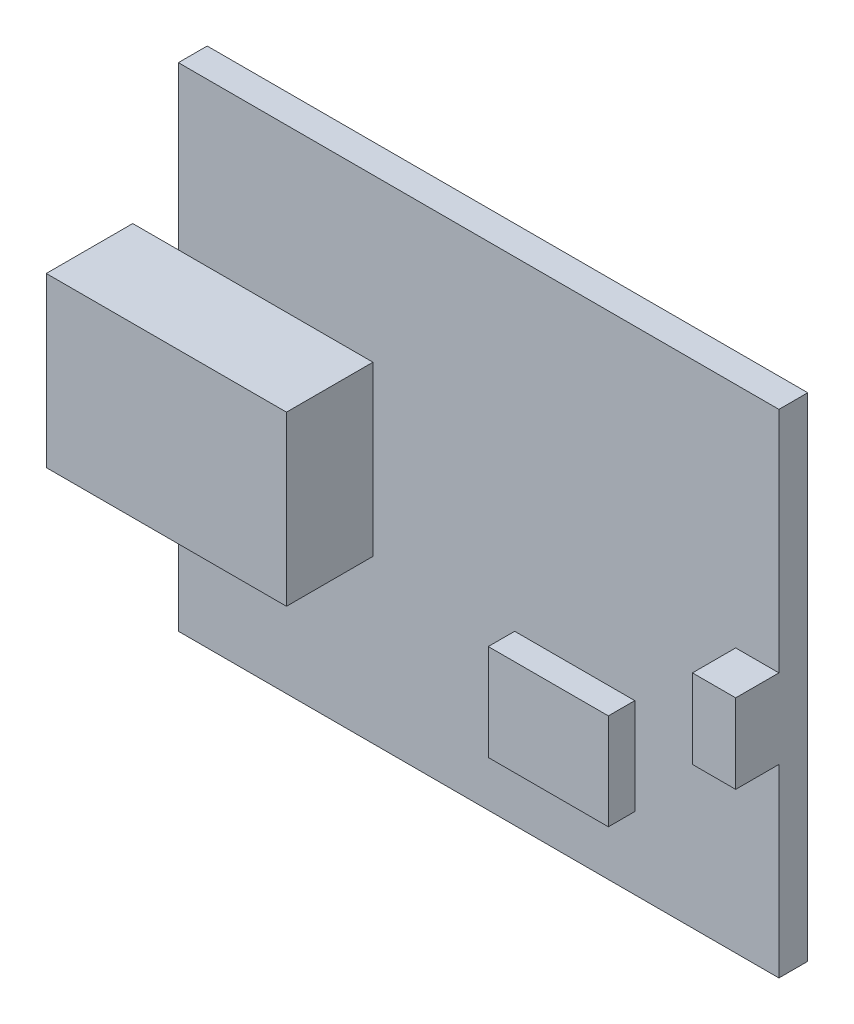
ISO-10303-21;
HEADER;
FILE_DESCRIPTION(('STEP AP214'),'2;1');
FILE_NAME('part.step','',(''),(''),'','','');
FILE_SCHEMA(('AUTOMOTIVE_DESIGN { 1 0 10303 214 1 1 1 1 }'));
ENDSEC;
DATA;
#1=APPLICATION_CONTEXT('core data for automotive mechanical design processes');
#2=APPLICATION_PROTOCOL_DEFINITION('international standard','automotive_design',2000,#1);
#3=PRODUCT_CONTEXT('',#1,'mechanical');
#4=PRODUCT('Part','Part','',(#3));
#5=PRODUCT_RELATED_PRODUCT_CATEGORY('part','',(#4));
#6=PRODUCT_DEFINITION_FORMATION('','',#4);
#7=PRODUCT_DEFINITION_CONTEXT('part definition',#1,'design');
#8=PRODUCT_DEFINITION('design','',#6,#7);
#9=PRODUCT_DEFINITION_SHAPE('','',#8);
#10=(LENGTH_UNIT() NAMED_UNIT(*) SI_UNIT(.MILLI.,.METRE.));
#11=(NAMED_UNIT(*) PLANE_ANGLE_UNIT() SI_UNIT($,.RADIAN.));
#12=(NAMED_UNIT(*) SI_UNIT($,.STERADIAN.) SOLID_ANGLE_UNIT());
#13=UNCERTAINTY_MEASURE_WITH_UNIT(LENGTH_MEASURE(1.E-05),#10,'distance_accuracy_value','');
#14=(GEOMETRIC_REPRESENTATION_CONTEXT(3) GLOBAL_UNCERTAINTY_ASSIGNED_CONTEXT((#13)) GLOBAL_UNIT_ASSIGNED_CONTEXT((#10,
#11,#12)) REPRESENTATION_CONTEXT('',''));
#15=CARTESIAN_POINT('',(0.,0.,0.));
#16=DIRECTION('',(0.,0.,1.));
#17=DIRECTION('',(1.,0.,0.));
#18=AXIS2_PLACEMENT_3D('',#15,#16,#17);
#19=CARTESIAN_POINT('',(-12.5,10.25,1.2));
#20=DIRECTION('',(0.,0.,-1.));
#21=DIRECTION('',(-1.,0.,0.));
#22=AXIS2_PLACEMENT_3D('',#19,#20,#21);
#23=PLANE('',#22);
#24=DIRECTION('',(1.,0.,0.));
#25=VECTOR('',#24,1.);
#26=CARTESIAN_POINT('',(10.7,-2.55,1.2));
#27=LINE('',#26,#25);
#28=CARTESIAN_POINT('',(10.7,-2.55,1.2));
#29=VERTEX_POINT('',#28);
#30=CARTESIAN_POINT('',(12.5,-2.55000000000001,1.2));
#31=VERTEX_POINT('',#30);
#32=EDGE_CURVE('E174',#29,#31,#27,.T.);
#33=ORIENTED_EDGE('',*,*,#32,.F.);
#34=DIRECTION('',(0.,-1.,0.));
#35=VECTOR('',#34,1.);
#36=CARTESIAN_POINT('',(10.7,0.749999999999997,1.2));
#37=LINE('',#36,#35);
#38=CARTESIAN_POINT('',(10.7,0.749999999999997,1.2));
#39=VERTEX_POINT('',#38);
#40=EDGE_CURVE('E171',#39,#29,#37,.T.);
#41=ORIENTED_EDGE('',*,*,#40,.F.);
#42=DIRECTION('',(-1.,0.,0.));
#43=VECTOR('',#42,1.);
#44=CARTESIAN_POINT('',(10.7,0.749999999999997,1.2));
#45=LINE('',#44,#43);
#46=CARTESIAN_POINT('',(12.5,0.749999999999997,1.2));
#47=VERTEX_POINT('',#46);
#48=EDGE_CURVE('E184',#47,#39,#45,.T.);
#49=ORIENTED_EDGE('',*,*,#48,.F.);
#50=DIRECTION('',(0.,1.,0.));
#51=VECTOR('',#50,1.);
#52=CARTESIAN_POINT('',(12.5,-10.25,1.2));
#53=LINE('',#52,#51);
#54=CARTESIAN_POINT('',(12.5,10.25,1.2));
#55=VERTEX_POINT('',#54);
#56=EDGE_CURVE('E250',#47,#55,#53,.T.);
#57=ORIENTED_EDGE('',*,*,#56,.T.);
#58=DIRECTION('',(-1.,0.,0.));
#59=VECTOR('',#58,1.);
#60=CARTESIAN_POINT('',(-12.5,10.25,1.2));
#61=LINE('',#60,#59);
#62=CARTESIAN_POINT('',(-12.5,10.25,1.2));
#63=VERTEX_POINT('',#62);
#64=EDGE_CURVE('E253',#55,#63,#61,.T.);
#65=ORIENTED_EDGE('',*,*,#64,.T.);
#66=DIRECTION('',(0.,-1.,0.));
#67=VECTOR('',#66,1.);
#68=CARTESIAN_POINT('',(-12.5,-10.25,1.2));
#69=LINE('',#68,#67);
#70=CARTESIAN_POINT('',(-12.5,3.5,1.2));
#71=VERTEX_POINT('',#70);
#72=EDGE_CURVE('E243',#63,#71,#69,.T.);
#73=ORIENTED_EDGE('',*,*,#72,.T.);
#74=DIRECTION('',(-1.,0.,0.));
#75=VECTOR('',#74,1.);
#76=CARTESIAN_POINT('',(-4.4,3.5,1.2));
#77=LINE('',#76,#75);
#78=CARTESIAN_POINT('',(-4.4,3.5,1.2));
#79=VERTEX_POINT('',#78);
#80=EDGE_CURVE('E231',#79,#71,#77,.T.);
#81=ORIENTED_EDGE('',*,*,#80,.F.);
#82=DIRECTION('',(0.,-1.,0.));
#83=VECTOR('',#82,1.);
#84=CARTESIAN_POINT('',(-4.4,3.5,1.2));
#85=LINE('',#84,#83);
#86=CARTESIAN_POINT('',(-4.4,-3.5,1.2));
#87=VERTEX_POINT('',#86);
#88=EDGE_CURVE('E207',#79,#87,#85,.T.);
#89=ORIENTED_EDGE('',*,*,#88,.T.);
#90=DIRECTION('',(-1.,0.,0.));
#91=VECTOR('',#90,1.);
#92=CARTESIAN_POINT('',(-4.4,-3.5,1.2));
#93=LINE('',#92,#91);
#94=CARTESIAN_POINT('',(-12.5,-3.5,1.2));
#95=VERTEX_POINT('',#94);
#96=EDGE_CURVE('E240',#87,#95,#93,.T.);
#97=ORIENTED_EDGE('',*,*,#96,.T.);
#98=CARTESIAN_POINT('',(-12.5,-10.25,1.2));
#99=VERTEX_POINT('',#98);
#100=EDGE_CURVE('E248',#95,#99,#69,.T.);
#101=ORIENTED_EDGE('',*,*,#100,.T.);
#102=DIRECTION('',(1.,0.,0.));
#103=VECTOR('',#102,1.);
#104=CARTESIAN_POINT('',(-12.5,-10.25,1.2));
#105=LINE('',#104,#103);
#106=CARTESIAN_POINT('',(12.5,-10.25,1.2));
#107=VERTEX_POINT('',#106);
#108=EDGE_CURVE('E246',#99,#107,#105,.T.);
#109=ORIENTED_EDGE('',*,*,#108,.T.);
#110=EDGE_CURVE('E251',#107,#31,#53,.T.);
#111=ORIENTED_EDGE('',*,*,#110,.T.);
#112=EDGE_LOOP('',(#33,#41,#49,#57,#65,#73,#81,#89,#97,#101,#109,#111));
#113=FACE_BOUND('',#112,.T.);
#114=DIRECTION('',(0.,-1.,0.));
#115=VECTOR('',#114,1.);
#116=CARTESIAN_POINT('',(1.5,-3.25,1.2));
#117=LINE('',#116,#115);
#118=CARTESIAN_POINT('',(1.5,-3.25,1.2));
#119=VERTEX_POINT('',#118);
#120=CARTESIAN_POINT('',(1.5,-7.25,1.2));
#121=VERTEX_POINT('',#120);
#122=EDGE_CURVE('E170',#119,#121,#117,.T.);
#123=ORIENTED_EDGE('',*,*,#122,.F.);
#124=DIRECTION('',(-1.,0.,0.));
#125=VECTOR('',#124,1.);
#126=CARTESIAN_POINT('',(1.5,-3.25,1.2));
#127=LINE('',#126,#125);
#128=CARTESIAN_POINT('',(6.5,-3.25,1.2));
#129=VERTEX_POINT('',#128);
#130=EDGE_CURVE('E167',#129,#119,#127,.T.);
#131=ORIENTED_EDGE('',*,*,#130,.F.);
#132=DIRECTION('',(0.,1.,0.));
#133=VECTOR('',#132,1.);
#134=CARTESIAN_POINT('',(6.5,-3.25,1.2));
#135=LINE('',#134,#133);
#136=CARTESIAN_POINT('',(6.5,-7.25,1.2));
#137=VERTEX_POINT('',#136);
#138=EDGE_CURVE('E51',#137,#129,#135,.T.);
#139=ORIENTED_EDGE('',*,*,#138,.F.);
#140=DIRECTION('',(1.,0.,0.));
#141=VECTOR('',#140,1.);
#142=CARTESIAN_POINT('',(1.5,-7.25,1.2));
#143=LINE('',#142,#141);
#144=EDGE_CURVE('E46',#121,#137,#143,.T.);
#145=ORIENTED_EDGE('',*,*,#144,.F.);
#146=EDGE_LOOP('',(#123,#131,#139,#145));
#147=FACE_BOUND('',#146,.T.);
#148=ADVANCED_FACE('F31',(#113,#147),#23,.F.);
#149=CARTESIAN_POINT('',(-12.5,-10.25,1.2));
#150=DIRECTION('',(1.,0.,0.));
#151=DIRECTION('',(0.,0.,-1.));
#152=AXIS2_PLACEMENT_3D('',#149,#150,#151);
#153=PLANE('',#152);
#154=DIRECTION('',(0.,-1.,0.));
#155=VECTOR('',#154,1.);
#156=CARTESIAN_POINT('',(-12.5,-10.25,0.));
#157=LINE('',#156,#155);
#158=CARTESIAN_POINT('',(-12.5,10.25,0.));
#159=VERTEX_POINT('',#158);
#160=CARTESIAN_POINT('',(-12.5,-10.25,0.));
#161=VERTEX_POINT('',#160);
#162=EDGE_CURVE('E234',#159,#161,#157,.T.);
#163=ORIENTED_EDGE('',*,*,#162,.T.);
#164=DIRECTION('',(0.,0.,-1.));
#165=VECTOR('',#164,1.);
#166=CARTESIAN_POINT('',(-12.5,-10.25,1.2));
#167=LINE('',#166,#165);
#168=EDGE_CURVE('E11',#99,#161,#167,.T.);
#169=ORIENTED_EDGE('',*,*,#168,.F.);
#170=ORIENTED_EDGE('',*,*,#100,.F.);
#171=EDGE_CURVE('E247',#71,#95,#69,.T.);
#172=ORIENTED_EDGE('',*,*,#171,.F.);
#173=ORIENTED_EDGE('',*,*,#72,.F.);
#174=DIRECTION('',(0.,0.,-1.));
#175=VECTOR('',#174,1.);
#176=CARTESIAN_POINT('',(-12.5,10.25,1.2));
#177=LINE('',#176,#175);
#178=EDGE_CURVE('E255',#63,#159,#177,.T.);
#179=ORIENTED_EDGE('',*,*,#178,.T.);
#180=EDGE_LOOP('',(#163,#169,#170,#172,#173,#179));
#181=FACE_BOUND('',#180,.T.);
#182=ADVANCED_FACE('F33',(#181),#153,.F.);
#183=CARTESIAN_POINT('',(-12.5,-10.25,1.2));
#184=DIRECTION('',(0.,1.,0.));
#185=DIRECTION('',(0.,0.,1.));
#186=AXIS2_PLACEMENT_3D('',#183,#184,#185);
#187=PLANE('',#186);
#188=DIRECTION('',(1.,0.,0.));
#189=VECTOR('',#188,1.);
#190=CARTESIAN_POINT('',(-12.5,-10.25,0.));
#191=LINE('',#190,#189);
#192=CARTESIAN_POINT('',(12.5,-10.25,0.));
#193=VERTEX_POINT('',#192);
#194=EDGE_CURVE('E258',#161,#193,#191,.T.);
#195=ORIENTED_EDGE('',*,*,#194,.T.);
#196=DIRECTION('',(0.,0.,-1.));
#197=VECTOR('',#196,1.);
#198=CARTESIAN_POINT('',(12.5,-10.25,1.2));
#199=LINE('',#198,#197);
#200=EDGE_CURVE('E39',#107,#193,#199,.T.);
#201=ORIENTED_EDGE('',*,*,#200,.F.);
#202=ORIENTED_EDGE('',*,*,#108,.F.);
#203=ORIENTED_EDGE('',*,*,#168,.T.);
#204=EDGE_LOOP('',(#195,#201,#202,#203));
#205=FACE_BOUND('',#204,.T.);
#206=ADVANCED_FACE('F307',(#205),#187,.F.);
#207=CARTESIAN_POINT('',(12.5,-10.25,1.2));
#208=DIRECTION('',(-1.,0.,0.));
#209=DIRECTION('',(0.,0.,1.));
#210=AXIS2_PLACEMENT_3D('',#207,#208,#209);
#211=PLANE('',#210);
#212=DIRECTION('',(0.,1.,0.));
#213=VECTOR('',#212,1.);
#214=CARTESIAN_POINT('',(12.5,-10.25,0.));
#215=LINE('',#214,#213);
#216=CARTESIAN_POINT('',(12.5,10.25,0.));
#217=VERTEX_POINT('',#216);
#218=EDGE_CURVE('E260',#193,#217,#215,.T.);
#219=ORIENTED_EDGE('',*,*,#218,.T.);
#220=DIRECTION('',(0.,0.,-1.));
#221=VECTOR('',#220,1.);
#222=CARTESIAN_POINT('',(12.5,10.25,1.2));
#223=LINE('',#222,#221);
#224=EDGE_CURVE('E266',#55,#217,#223,.T.);
#225=ORIENTED_EDGE('',*,*,#224,.F.);
#226=ORIENTED_EDGE('',*,*,#56,.F.);
#227=DIRECTION('',(0.,0.,-1.));
#228=VECTOR('',#227,1.);
#229=CARTESIAN_POINT('',(12.5,0.749999999999997,3.));
#230=LINE('',#229,#228);
#231=CARTESIAN_POINT('',(12.5,0.749999999999997,3.));
#232=VERTEX_POINT('',#231);
#233=EDGE_CURVE('E197',#232,#47,#230,.T.);
#234=ORIENTED_EDGE('',*,*,#233,.F.);
#235=DIRECTION('',(0.,1.,0.));
#236=VECTOR('',#235,1.);
#237=CARTESIAN_POINT('',(12.5,0.749999999999997,3.));
#238=LINE('',#237,#236);
#239=CARTESIAN_POINT('',(12.5,-2.55,3.));
#240=VERTEX_POINT('',#239);
#241=EDGE_CURVE('E186',#240,#232,#238,.T.);
#242=ORIENTED_EDGE('',*,*,#241,.F.);
#243=DIRECTION('',(0.,0.,-1.));
#244=VECTOR('',#243,1.);
#245=CARTESIAN_POINT('',(12.5,-2.55,3.));
#246=LINE('',#245,#244);
#247=EDGE_CURVE('E200',#240,#31,#246,.T.);
#248=ORIENTED_EDGE('',*,*,#247,.T.);
#249=ORIENTED_EDGE('',*,*,#110,.F.);
#250=ORIENTED_EDGE('',*,*,#200,.T.);
#251=EDGE_LOOP('',(#219,#225,#226,#234,#242,#248,#249,#250));
#252=FACE_BOUND('',#251,.T.);
#253=ADVANCED_FACE('F273',(#252),#211,.F.);
#254=CARTESIAN_POINT('',(-12.5,10.25,1.2));
#255=DIRECTION('',(0.,-1.,0.));
#256=DIRECTION('',(1.,0.,0.));
#257=AXIS2_PLACEMENT_3D('',#254,#255,#256);
#258=PLANE('',#257);
#259=DIRECTION('',(-1.,0.,0.));
#260=VECTOR('',#259,1.);
#261=CARTESIAN_POINT('',(-12.5,10.25,0.));
#262=LINE('',#261,#260);
#263=EDGE_CURVE('E262',#217,#159,#262,.T.);
#264=ORIENTED_EDGE('',*,*,#263,.T.);
#265=ORIENTED_EDGE('',*,*,#178,.F.);
#266=ORIENTED_EDGE('',*,*,#64,.F.);
#267=ORIENTED_EDGE('',*,*,#224,.T.);
#268=EDGE_LOOP('',(#264,#265,#266,#267));
#269=FACE_BOUND('',#268,.T.);
#270=ADVANCED_FACE('F283',(#269),#258,.F.);
#271=CARTESIAN_POINT('',(-12.5,10.25,0.));
#272=DIRECTION('',(0.,0.,-1.));
#273=DIRECTION('',(-1.,0.,0.));
#274=AXIS2_PLACEMENT_3D('',#271,#272,#273);
#275=PLANE('',#274);
#276=ORIENTED_EDGE('',*,*,#162,.F.);
#277=ORIENTED_EDGE('',*,*,#263,.F.);
#278=ORIENTED_EDGE('',*,*,#218,.F.);
#279=ORIENTED_EDGE('',*,*,#194,.F.);
#280=EDGE_LOOP('',(#276,#277,#278,#279));
#281=FACE_BOUND('',#280,.T.);
#282=ADVANCED_FACE('F280',(#281),#275,.T.);
#283=CARTESIAN_POINT('',(-4.4,3.5,1.2));
#284=DIRECTION('',(0.,0.,-1.));
#285=DIRECTION('',(0.,1.,0.));
#286=AXIS2_PLACEMENT_3D('',#283,#284,#285);
#287=PLANE('',#286);
#288=CARTESIAN_POINT('',(-14.4,3.5,1.2));
#289=VERTEX_POINT('',#288);
#290=EDGE_CURVE('E235',#71,#289,#77,.T.);
#291=ORIENTED_EDGE('',*,*,#290,.F.);
#292=ORIENTED_EDGE('',*,*,#171,.T.);
#293=CARTESIAN_POINT('',(-14.4,-3.5,1.2));
#294=VERTEX_POINT('',#293);
#295=EDGE_CURVE('E220',#95,#294,#93,.T.);
#296=ORIENTED_EDGE('',*,*,#295,.T.);
#297=DIRECTION('',(0.,-1.,0.));
#298=VECTOR('',#297,1.);
#299=CARTESIAN_POINT('',(-14.4,3.5,1.2));
#300=LINE('',#299,#298);
#301=EDGE_CURVE('E206',#289,#294,#300,.T.);
#302=ORIENTED_EDGE('',*,*,#301,.F.);
#303=EDGE_LOOP('',(#291,#292,#296,#302));
#304=FACE_BOUND('',#303,.T.);
#305=ADVANCED_FACE('F309',(#304),#287,.T.);
#306=CARTESIAN_POINT('',(-4.4,3.5,1.2));
#307=DIRECTION('',(0.,1.,0.));
#308=DIRECTION('',(0.,0.,1.));
#309=AXIS2_PLACEMENT_3D('',#306,#307,#308);
#310=PLANE('',#309);
#311=DIRECTION('',(0.,0.,-1.));
#312=VECTOR('',#311,1.);
#313=CARTESIAN_POINT('',(-14.4,3.5,1.2));
#314=LINE('',#313,#312);
#315=CARTESIAN_POINT('',(-14.4,3.5,4.8));
#316=VERTEX_POINT('',#315);
#317=EDGE_CURVE('E211',#316,#289,#314,.T.);
#318=ORIENTED_EDGE('',*,*,#317,.F.);
#319=DIRECTION('',(-1.,0.,0.));
#320=VECTOR('',#319,1.);
#321=CARTESIAN_POINT('',(-4.4,3.5,4.8));
#322=LINE('',#321,#320);
#323=CARTESIAN_POINT('',(-4.4,3.5,4.8));
#324=VERTEX_POINT('',#323);
#325=EDGE_CURVE('E236',#324,#316,#322,.T.);
#326=ORIENTED_EDGE('',*,*,#325,.F.);
#327=DIRECTION('',(0.,0.,-1.));
#328=VECTOR('',#327,1.);
#329=CARTESIAN_POINT('',(-4.4,3.5,1.2));
#330=LINE('',#329,#328);
#331=EDGE_CURVE('E217',#324,#79,#330,.T.);
#332=ORIENTED_EDGE('',*,*,#331,.T.);
#333=ORIENTED_EDGE('',*,*,#80,.T.);
#334=ORIENTED_EDGE('',*,*,#290,.T.);
#335=EDGE_LOOP('',(#318,#326,#332,#333,#334));
#336=FACE_BOUND('',#335,.T.);
#337=ADVANCED_FACE('F326',(#336),#310,.T.);
#338=CARTESIAN_POINT('',(-4.4,3.5,4.8));
#339=DIRECTION('',(0.,0.,1.));
#340=DIRECTION('',(1.,0.,0.));
#341=AXIS2_PLACEMENT_3D('',#338,#339,#340);
#342=PLANE('',#341);
#343=DIRECTION('',(0.,1.,0.));
#344=VECTOR('',#343,1.);
#345=CARTESIAN_POINT('',(-14.4,3.5,4.8));
#346=LINE('',#345,#344);
#347=CARTESIAN_POINT('',(-14.4,-3.5,4.8));
#348=VERTEX_POINT('',#347);
#349=EDGE_CURVE('E226',#348,#316,#346,.T.);
#350=ORIENTED_EDGE('',*,*,#349,.F.);
#351=DIRECTION('',(-1.,0.,0.));
#352=VECTOR('',#351,1.);
#353=CARTESIAN_POINT('',(-4.4,-3.5,4.8));
#354=LINE('',#353,#352);
#355=CARTESIAN_POINT('',(-4.4,-3.5,4.8));
#356=VERTEX_POINT('',#355);
#357=EDGE_CURVE('E238',#356,#348,#354,.T.);
#358=ORIENTED_EDGE('',*,*,#357,.F.);
#359=DIRECTION('',(0.,1.,0.));
#360=VECTOR('',#359,1.);
#361=CARTESIAN_POINT('',(-4.4,3.5,4.8));
#362=LINE('',#361,#360);
#363=EDGE_CURVE('E214',#356,#324,#362,.T.);
#364=ORIENTED_EDGE('',*,*,#363,.T.);
#365=ORIENTED_EDGE('',*,*,#325,.T.);
#366=EDGE_LOOP('',(#350,#358,#364,#365));
#367=FACE_BOUND('',#366,.T.);
#368=ADVANCED_FACE('F321',(#367),#342,.T.);
#369=CARTESIAN_POINT('',(-4.4,-3.5,1.2));
#370=DIRECTION('',(0.,-1.,0.));
#371=DIRECTION('',(0.,0.,-1.));
#372=AXIS2_PLACEMENT_3D('',#369,#370,#371);
#373=PLANE('',#372);
#374=DIRECTION('',(0.,0.,1.));
#375=VECTOR('',#374,1.);
#376=CARTESIAN_POINT('',(-14.4,-3.5,1.2));
#377=LINE('',#376,#375);
#378=EDGE_CURVE('E223',#294,#348,#377,.T.);
#379=ORIENTED_EDGE('',*,*,#378,.F.);
#380=ORIENTED_EDGE('',*,*,#295,.F.);
#381=ORIENTED_EDGE('',*,*,#96,.F.);
#382=DIRECTION('',(0.,0.,1.));
#383=VECTOR('',#382,1.);
#384=CARTESIAN_POINT('',(-4.4,-3.5,1.2));
#385=LINE('',#384,#383);
#386=EDGE_CURVE('E210',#87,#356,#385,.T.);
#387=ORIENTED_EDGE('',*,*,#386,.T.);
#388=ORIENTED_EDGE('',*,*,#357,.T.);
#389=EDGE_LOOP('',(#379,#380,#381,#387,#388));
#390=FACE_BOUND('',#389,.T.);
#391=ADVANCED_FACE('F314',(#390),#373,.T.);
#392=CARTESIAN_POINT('',(-4.4,-3.5,1.2));
#393=DIRECTION('',(-1.,0.,0.));
#394=DIRECTION('',(0.,0.,1.));
#395=AXIS2_PLACEMENT_3D('',#392,#393,#394);
#396=PLANE('',#395);
#397=ORIENTED_EDGE('',*,*,#88,.F.);
#398=ORIENTED_EDGE('',*,*,#331,.F.);
#399=ORIENTED_EDGE('',*,*,#363,.F.);
#400=ORIENTED_EDGE('',*,*,#386,.F.);
#401=EDGE_LOOP('',(#397,#398,#399,#400));
#402=FACE_BOUND('',#401,.T.);
#403=ADVANCED_FACE('F317',(#402),#396,.F.);
#404=CARTESIAN_POINT('',(-14.4,-3.5,1.2));
#405=DIRECTION('',(-1.,0.,0.));
#406=DIRECTION('',(0.,0.,1.));
#407=AXIS2_PLACEMENT_3D('',#404,#405,#406);
#408=PLANE('',#407);
#409=ORIENTED_EDGE('',*,*,#301,.T.);
#410=ORIENTED_EDGE('',*,*,#378,.T.);
#411=ORIENTED_EDGE('',*,*,#349,.T.);
#412=ORIENTED_EDGE('',*,*,#317,.T.);
#413=EDGE_LOOP('',(#409,#410,#411,#412));
#414=FACE_BOUND('',#413,.T.);
#415=ADVANCED_FACE('F323',(#414),#408,.T.);
#416=CARTESIAN_POINT('',(10.7,0.749999999999997,3.));
#417=DIRECTION('',(1.,0.,0.));
#418=DIRECTION('',(0.,0.,-1.));
#419=AXIS2_PLACEMENT_3D('',#416,#417,#418);
#420=PLANE('',#419);
#421=ORIENTED_EDGE('',*,*,#40,.T.);
#422=DIRECTION('',(0.,0.,-1.));
#423=VECTOR('',#422,1.);
#424=CARTESIAN_POINT('',(10.7,-2.55,3.));
#425=LINE('',#424,#423);
#426=CARTESIAN_POINT('',(10.7,-2.55,3.));
#427=VERTEX_POINT('',#426);
#428=EDGE_CURVE('E203',#427,#29,#425,.T.);
#429=ORIENTED_EDGE('',*,*,#428,.F.);
#430=DIRECTION('',(0.,-1.,0.));
#431=VECTOR('',#430,1.);
#432=CARTESIAN_POINT('',(10.7,0.749999999999997,3.));
#433=LINE('',#432,#431);
#434=CARTESIAN_POINT('',(10.7,0.749999999999997,3.));
#435=VERTEX_POINT('',#434);
#436=EDGE_CURVE('E180',#435,#427,#433,.T.);
#437=ORIENTED_EDGE('',*,*,#436,.F.);
#438=DIRECTION('',(0.,0.,-1.));
#439=VECTOR('',#438,1.);
#440=CARTESIAN_POINT('',(10.7,0.749999999999997,3.));
#441=LINE('',#440,#439);
#442=EDGE_CURVE('E189',#435,#39,#441,.T.);
#443=ORIENTED_EDGE('',*,*,#442,.T.);
#444=EDGE_LOOP('',(#421,#429,#437,#443));
#445=FACE_BOUND('',#444,.T.);
#446=ADVANCED_FACE('F405',(#445),#420,.F.);
#447=CARTESIAN_POINT('',(10.7,-2.55,3.));
#448=DIRECTION('',(0.,1.,0.));
#449=DIRECTION('',(0.,0.,1.));
#450=AXIS2_PLACEMENT_3D('',#447,#448,#449);
#451=PLANE('',#450);
#452=ORIENTED_EDGE('',*,*,#32,.T.);
#453=ORIENTED_EDGE('',*,*,#247,.F.);
#454=DIRECTION('',(1.,0.,0.));
#455=VECTOR('',#454,1.);
#456=CARTESIAN_POINT('',(10.7,-2.55,3.));
#457=LINE('',#456,#455);
#458=EDGE_CURVE('E183',#427,#240,#457,.T.);
#459=ORIENTED_EDGE('',*,*,#458,.F.);
#460=ORIENTED_EDGE('',*,*,#428,.T.);
#461=EDGE_LOOP('',(#452,#453,#459,#460));
#462=FACE_BOUND('',#461,.T.);
#463=ADVANCED_FACE('F306',(#462),#451,.F.);
#464=CARTESIAN_POINT('',(10.7,0.749999999999997,3.));
#465=DIRECTION('',(0.,-1.,0.));
#466=DIRECTION('',(0.,0.,-1.));
#467=AXIS2_PLACEMENT_3D('',#464,#465,#466);
#468=PLANE('',#467);
#469=ORIENTED_EDGE('',*,*,#48,.T.);
#470=ORIENTED_EDGE('',*,*,#442,.F.);
#471=DIRECTION('',(-1.,0.,0.));
#472=VECTOR('',#471,1.);
#473=CARTESIAN_POINT('',(10.7,0.749999999999997,3.));
#474=LINE('',#473,#472);
#475=EDGE_CURVE('E188',#232,#435,#474,.T.);
#476=ORIENTED_EDGE('',*,*,#475,.F.);
#477=ORIENTED_EDGE('',*,*,#233,.T.);
#478=EDGE_LOOP('',(#469,#470,#476,#477));
#479=FACE_BOUND('',#478,.T.);
#480=ADVANCED_FACE('F299',(#479),#468,.F.);
#481=CARTESIAN_POINT('',(10.7,-2.55,3.));
#482=DIRECTION('',(0.,0.,1.));
#483=DIRECTION('',(1.,0.,0.));
#484=AXIS2_PLACEMENT_3D('',#481,#482,#483);
#485=PLANE('',#484);
#486=ORIENTED_EDGE('',*,*,#436,.T.);
#487=ORIENTED_EDGE('',*,*,#458,.T.);
#488=ORIENTED_EDGE('',*,*,#241,.T.);
#489=ORIENTED_EDGE('',*,*,#475,.T.);
#490=EDGE_LOOP('',(#486,#487,#488,#489));
#491=FACE_BOUND('',#490,.T.);
#492=ADVANCED_FACE('F302',(#491),#485,.T.);
#493=CARTESIAN_POINT('',(1.5,-3.25,2.3));
#494=DIRECTION('',(1.,0.,0.));
#495=DIRECTION('',(0.,0.,-1.));
#496=AXIS2_PLACEMENT_3D('',#493,#494,#495);
#497=PLANE('',#496);
#498=ORIENTED_EDGE('',*,*,#122,.T.);
#499=DIRECTION('',(0.,0.,-1.));
#500=VECTOR('',#499,1.);
#501=CARTESIAN_POINT('',(1.5,-7.25,2.3));
#502=LINE('',#501,#500);
#503=CARTESIAN_POINT('',(1.5,-7.25,2.3));
#504=VERTEX_POINT('',#503);
#505=EDGE_CURVE('E151',#504,#121,#502,.T.);
#506=ORIENTED_EDGE('',*,*,#505,.F.);
#507=DIRECTION('',(0.,-1.,0.));
#508=VECTOR('',#507,1.);
#509=CARTESIAN_POINT('',(1.5,-3.25,2.3));
#510=LINE('',#509,#508);
#511=CARTESIAN_POINT('',(1.5,-3.25,2.3));
#512=VERTEX_POINT('',#511);
#513=EDGE_CURVE('E158',#512,#504,#510,.T.);
#514=ORIENTED_EDGE('',*,*,#513,.F.);
#515=DIRECTION('',(0.,0.,-1.));
#516=VECTOR('',#515,1.);
#517=CARTESIAN_POINT('',(1.5,-3.25,2.3));
#518=LINE('',#517,#516);
#519=EDGE_CURVE('E504',#512,#119,#518,.T.);
#520=ORIENTED_EDGE('',*,*,#519,.T.);
#521=EDGE_LOOP('',(#498,#506,#514,#520));
#522=FACE_BOUND('',#521,.T.);
#523=ADVANCED_FACE('F169',(#522),#497,.F.);
#524=CARTESIAN_POINT('',(1.5,-7.25,2.3));
#525=DIRECTION('',(0.,1.,0.));
#526=DIRECTION('',(0.,0.,1.));
#527=AXIS2_PLACEMENT_3D('',#524,#525,#526);
#528=PLANE('',#527);
#529=ORIENTED_EDGE('',*,*,#144,.T.);
#530=DIRECTION('',(0.,0.,-1.));
#531=VECTOR('',#530,1.);
#532=CARTESIAN_POINT('',(6.5,-7.25,2.3));
#533=LINE('',#532,#531);
#534=CARTESIAN_POINT('',(6.5,-7.25,2.3));
#535=VERTEX_POINT('',#534);
#536=EDGE_CURVE('E154',#535,#137,#533,.T.);
#537=ORIENTED_EDGE('',*,*,#536,.F.);
#538=DIRECTION('',(1.,0.,0.));
#539=VECTOR('',#538,1.);
#540=CARTESIAN_POINT('',(1.5,-7.25,2.3));
#541=LINE('',#540,#539);
#542=EDGE_CURVE('E147',#504,#535,#541,.T.);
#543=ORIENTED_EDGE('',*,*,#542,.F.);
#544=ORIENTED_EDGE('',*,*,#505,.T.);
#545=EDGE_LOOP('',(#529,#537,#543,#544));
#546=FACE_BOUND('',#545,.T.);
#547=ADVANCED_FACE('F149',(#546),#528,.F.);
#548=CARTESIAN_POINT('',(6.5,-3.25,2.3));
#549=DIRECTION('',(-1.,0.,0.));
#550=DIRECTION('',(0.,0.,1.));
#551=AXIS2_PLACEMENT_3D('',#548,#549,#550);
#552=PLANE('',#551);
#553=ORIENTED_EDGE('',*,*,#138,.T.);
#554=DIRECTION('',(0.,0.,-1.));
#555=VECTOR('',#554,1.);
#556=CARTESIAN_POINT('',(6.5,-3.25,2.3));
#557=LINE('',#556,#555);
#558=CARTESIAN_POINT('',(6.5,-3.25,2.3));
#559=VERTEX_POINT('',#558);
#560=EDGE_CURVE('E176',#559,#129,#557,.T.);
#561=ORIENTED_EDGE('',*,*,#560,.F.);
#562=DIRECTION('',(0.,1.,0.));
#563=VECTOR('',#562,1.);
#564=CARTESIAN_POINT('',(6.5,-3.25,2.3));
#565=LINE('',#564,#563);
#566=EDGE_CURVE('E157',#535,#559,#565,.T.);
#567=ORIENTED_EDGE('',*,*,#566,.F.);
#568=ORIENTED_EDGE('',*,*,#536,.T.);
#569=EDGE_LOOP('',(#553,#561,#567,#568));
#570=FACE_BOUND('',#569,.T.);
#571=ADVANCED_FACE('F443',(#570),#552,.F.);
#572=CARTESIAN_POINT('',(1.5,-3.25,2.3));
#573=DIRECTION('',(0.,-1.,0.));
#574=DIRECTION('',(0.,0.,-1.));
#575=AXIS2_PLACEMENT_3D('',#572,#573,#574);
#576=PLANE('',#575);
#577=ORIENTED_EDGE('',*,*,#130,.T.);
#578=ORIENTED_EDGE('',*,*,#519,.F.);
#579=DIRECTION('',(-1.,0.,0.));
#580=VECTOR('',#579,1.);
#581=CARTESIAN_POINT('',(1.5,-3.25,2.3));
#582=LINE('',#581,#580);
#583=EDGE_CURVE('E163',#559,#512,#582,.T.);
#584=ORIENTED_EDGE('',*,*,#583,.F.);
#585=ORIENTED_EDGE('',*,*,#560,.T.);
#586=EDGE_LOOP('',(#577,#578,#584,#585));
#587=FACE_BOUND('',#586,.T.);
#588=ADVANCED_FACE('F450',(#587),#576,.F.);
#589=CARTESIAN_POINT('',(1.5,-7.25,2.3));
#590=DIRECTION('',(0.,0.,1.));
#591=DIRECTION('',(1.,0.,0.));
#592=AXIS2_PLACEMENT_3D('',#589,#590,#591);
#593=PLANE('',#592);
#594=ORIENTED_EDGE('',*,*,#513,.T.);
#595=ORIENTED_EDGE('',*,*,#542,.T.);
#596=ORIENTED_EDGE('',*,*,#566,.T.);
#597=ORIENTED_EDGE('',*,*,#583,.T.);
#598=EDGE_LOOP('',(#594,#595,#596,#597));
#599=FACE_BOUND('',#598,.T.);
#600=ADVANCED_FACE('F161',(#599),#593,.T.);
#601=CLOSED_SHELL('',(#148,#182,#206,#253,#270,#282,#305,#337,#368,#391,#403,#415,#446,#463,
#480,#492,#523,#547,#571,#588,#600));
#602=MANIFOLD_SOLID_BREP('B2',#601);
#603=ADVANCED_BREP_SHAPE_REPRESENTATION('',(#18,#602),#14);
#604=SHAPE_DEFINITION_REPRESENTATION(#9,#603);
ENDSEC;
END-ISO-10303-21;
